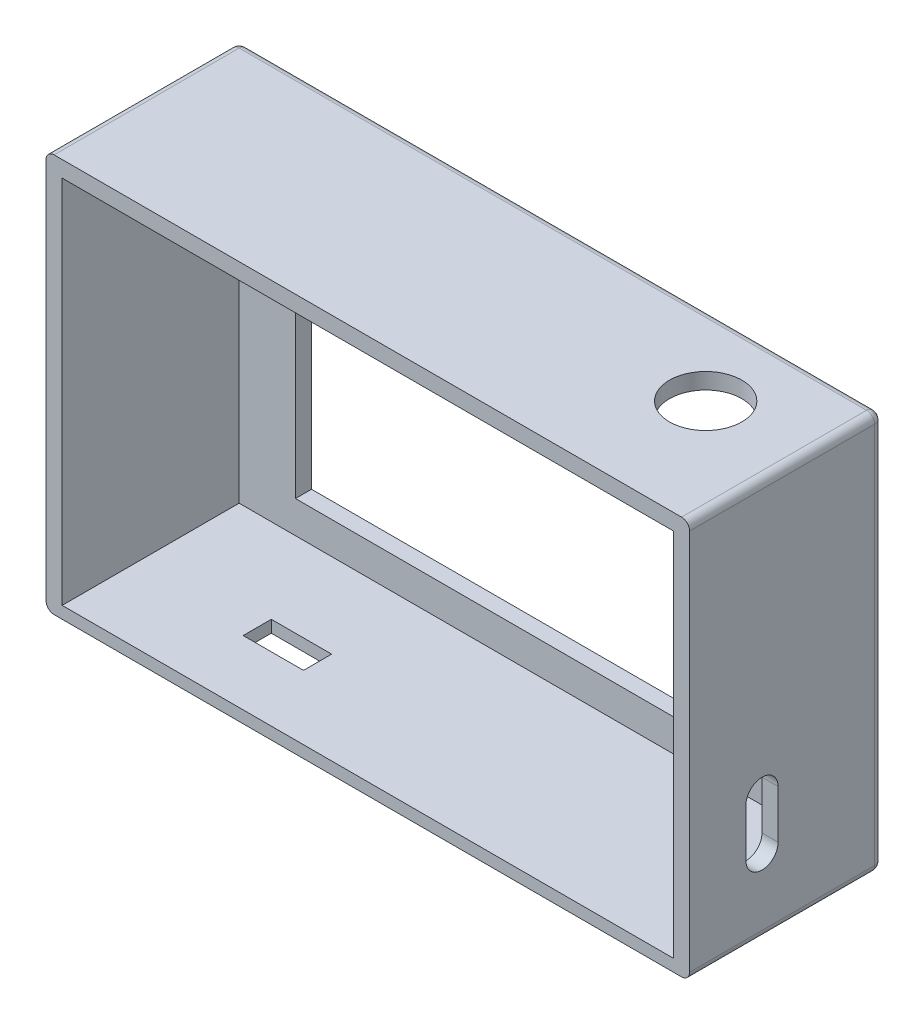
ISO-10303-21;
HEADER;
FILE_DESCRIPTION(('STEP AP214'),'2;1');
FILE_NAME('part.step','',(''),(''),'','','');
FILE_SCHEMA(('AUTOMOTIVE_DESIGN { 1 0 10303 214 1 1 1 1 }'));
ENDSEC;
DATA;
#1=APPLICATION_CONTEXT('core data for automotive mechanical design processes');
#2=APPLICATION_PROTOCOL_DEFINITION('international standard','automotive_design',2000,#1);
#3=PRODUCT_CONTEXT('',#1,'mechanical');
#4=PRODUCT('Part','Part','',(#3));
#5=PRODUCT_RELATED_PRODUCT_CATEGORY('part','',(#4));
#6=PRODUCT_DEFINITION_FORMATION('','',#4);
#7=PRODUCT_DEFINITION_CONTEXT('part definition',#1,'design');
#8=PRODUCT_DEFINITION('design','',#6,#7);
#9=PRODUCT_DEFINITION_SHAPE('','',#8);
#10=(LENGTH_UNIT() NAMED_UNIT(*) SI_UNIT(.MILLI.,.METRE.));
#11=(NAMED_UNIT(*) PLANE_ANGLE_UNIT() SI_UNIT($,.RADIAN.));
#12=(NAMED_UNIT(*) SI_UNIT($,.STERADIAN.) SOLID_ANGLE_UNIT());
#13=UNCERTAINTY_MEASURE_WITH_UNIT(LENGTH_MEASURE(1.E-05),#10,'distance_accuracy_value','');
#14=(GEOMETRIC_REPRESENTATION_CONTEXT(3) GLOBAL_UNCERTAINTY_ASSIGNED_CONTEXT((#13)) GLOBAL_UNIT_ASSIGNED_CONTEXT((#10,
#11,#12)) REPRESENTATION_CONTEXT('',''));
#15=CARTESIAN_POINT('',(0.,0.,0.));
#16=DIRECTION('',(0.,0.,1.));
#17=DIRECTION('',(1.,0.,0.));
#18=AXIS2_PLACEMENT_3D('',#15,#16,#17);
#19=CARTESIAN_POINT('',(38.,25.25,22.));
#20=DIRECTION('',(-1.,0.,0.));
#21=DIRECTION('',(0.,0.,1.));
#22=AXIS2_PLACEMENT_3D('',#19,#20,#21);
#23=PLANE('',#22);
#24=CARTESIAN_POINT('',(38.,-11.25,13.));
#25=DIRECTION('',(-1.,0.,0.));
#26=DIRECTION('',(0.,0.,1.));
#27=AXIS2_PLACEMENT_3D('',#24,#25,#26);
#28=CIRCLE('',#27,2.);
#29=CARTESIAN_POINT('',(38.,-11.25,11.));
#30=VERTEX_POINT('',#29);
#31=CARTESIAN_POINT('',(38.,-11.25,15.));
#32=VERTEX_POINT('',#31);
#33=EDGE_CURVE('E299',#30,#32,#28,.F.);
#34=ORIENTED_EDGE('',*,*,#33,.T.);
#35=DIRECTION('',(0.,-1.,0.));
#36=VECTOR('',#35,1.);
#37=CARTESIAN_POINT('',(38.,-11.25,15.));
#38=LINE('',#37,#36);
#39=CARTESIAN_POINT('',(38.,-17.25,15.));
#40=VERTEX_POINT('',#39);
#41=EDGE_CURVE('E301',#32,#40,#38,.T.);
#42=ORIENTED_EDGE('',*,*,#41,.T.);
#43=CARTESIAN_POINT('',(38.,-17.25,13.));
#44=DIRECTION('',(-1.,0.,0.));
#45=DIRECTION('',(0.,0.,1.));
#46=AXIS2_PLACEMENT_3D('',#43,#44,#45);
#47=CIRCLE('',#46,2.);
#48=CARTESIAN_POINT('',(38.,-17.25,11.));
#49=VERTEX_POINT('',#48);
#50=EDGE_CURVE('E325',#40,#49,#47,.F.);
#51=ORIENTED_EDGE('',*,*,#50,.T.);
#52=DIRECTION('',(0.,1.,0.));
#53=VECTOR('',#52,1.);
#54=CARTESIAN_POINT('',(38.,-11.25,11.));
#55=LINE('',#54,#53);
#56=EDGE_CURVE('E321',#49,#30,#55,.T.);
#57=ORIENTED_EDGE('',*,*,#56,.T.);
#58=EDGE_LOOP('',(#34,#42,#51,#57));
#59=FACE_BOUND('',#58,.T.);
#60=DIRECTION('',(0.,0.,-1.));
#61=VECTOR('',#60,1.);
#62=CARTESIAN_POINT('',(38.,-25.25,22.));
#63=LINE('',#62,#61);
#64=CARTESIAN_POINT('',(38.,-25.25,22.));
#65=VERTEX_POINT('',#64);
#66=CARTESIAN_POINT('',(38.,-25.25,0.));
#67=VERTEX_POINT('',#66);
#68=EDGE_CURVE('E339',#65,#67,#63,.T.);
#69=ORIENTED_EDGE('',*,*,#68,.F.);
#70=DIRECTION('',(0.,1.,0.));
#71=VECTOR('',#70,1.);
#72=CARTESIAN_POINT('',(38.,0.,22.));
#73=LINE('',#72,#71);
#74=CARTESIAN_POINT('',(38.,20.75,22.));
#75=VERTEX_POINT('',#74);
#76=EDGE_CURVE('E360',#65,#75,#73,.T.);
#77=ORIENTED_EDGE('',*,*,#76,.T.);
#78=DIRECTION('',(0.,0.,1.));
#79=VECTOR('',#78,1.);
#80=CARTESIAN_POINT('',(38.,20.75,0.));
#81=LINE('',#80,#79);
#82=CARTESIAN_POINT('',(38.,20.75,0.));
#83=VERTEX_POINT('',#82);
#84=EDGE_CURVE('E248',#83,#75,#81,.T.);
#85=ORIENTED_EDGE('',*,*,#84,.F.);
#86=DIRECTION('',(0.,1.,0.));
#87=VECTOR('',#86,1.);
#88=CARTESIAN_POINT('',(38.,25.25,0.));
#89=LINE('',#88,#87);
#90=EDGE_CURVE('E309',#67,#83,#89,.T.);
#91=ORIENTED_EDGE('',*,*,#90,.F.);
#92=EDGE_LOOP('',(#69,#77,#85,#91));
#93=FACE_BOUND('',#92,.T.);
#94=ADVANCED_FACE('F39',(#59,#93),#23,.T.);
#95=CARTESIAN_POINT('',(-38.,25.25,22.));
#96=DIRECTION('',(1.,0.,0.));
#97=DIRECTION('',(0.,0.,-1.));
#98=AXIS2_PLACEMENT_3D('',#95,#96,#97);
#99=PLANE('',#98);
#100=DIRECTION('',(0.,-1.,0.));
#101=VECTOR('',#100,1.);
#102=CARTESIAN_POINT('',(-38.,25.25,0.));
#103=LINE('',#102,#101);
#104=CARTESIAN_POINT('',(-38.,20.75,0.));
#105=VERTEX_POINT('',#104);
#106=CARTESIAN_POINT('',(-38.,-25.25,0.));
#107=VERTEX_POINT('',#106);
#108=EDGE_CURVE('E334',#105,#107,#103,.T.);
#109=ORIENTED_EDGE('',*,*,#108,.F.);
#110=DIRECTION('',(0.,0.,1.));
#111=VECTOR('',#110,1.);
#112=CARTESIAN_POINT('',(-38.,20.75,0.));
#113=LINE('',#112,#111);
#114=CARTESIAN_POINT('',(-38.,20.75,22.));
#115=VERTEX_POINT('',#114);
#116=EDGE_CURVE('E245',#105,#115,#113,.T.);
#117=ORIENTED_EDGE('',*,*,#116,.T.);
#118=DIRECTION('',(0.,-1.,0.));
#119=VECTOR('',#118,1.);
#120=CARTESIAN_POINT('',(-38.,0.,22.));
#121=LINE('',#120,#119);
#122=CARTESIAN_POINT('',(-38.,-25.25,22.));
#123=VERTEX_POINT('',#122);
#124=EDGE_CURVE('E354',#115,#123,#121,.T.);
#125=ORIENTED_EDGE('',*,*,#124,.T.);
#126=DIRECTION('',(0.,0.,-1.));
#127=VECTOR('',#126,1.);
#128=CARTESIAN_POINT('',(-38.,-25.25,22.));
#129=LINE('',#128,#127);
#130=EDGE_CURVE('E342',#123,#107,#129,.T.);
#131=ORIENTED_EDGE('',*,*,#130,.T.);
#132=EDGE_LOOP('',(#109,#117,#125,#131));
#133=FACE_BOUND('',#132,.T.);
#134=ADVANCED_FACE('F512',(#133),#99,.T.);
#135=CARTESIAN_POINT('',(0.,0.,0.));
#136=DIRECTION('',(0.,0.,-1.));
#137=DIRECTION('',(-1.,0.,0.));
#138=AXIS2_PLACEMENT_3D('',#135,#136,#137);
#139=PLANE('',#138);
#140=DIRECTION('',(1.,0.,0.));
#141=VECTOR('',#140,1.);
#142=CARTESIAN_POINT('',(0.,17.25,0.));
#143=LINE('',#142,#141);
#144=CARTESIAN_POINT('',(-31.,17.25,0.));
#145=VERTEX_POINT('',#144);
#146=CARTESIAN_POINT('',(31.,17.25,0.));
#147=VERTEX_POINT('',#146);
#148=EDGE_CURVE('E230',#145,#147,#143,.T.);
#149=ORIENTED_EDGE('',*,*,#148,.T.);
#150=DIRECTION('',(0.,-1.,0.));
#151=VECTOR('',#150,1.);
#152=CARTESIAN_POINT('',(31.,-19.25,0.));
#153=LINE('',#152,#151);
#154=CARTESIAN_POINT('',(31.,-21.25,0.));
#155=VERTEX_POINT('',#154);
#156=EDGE_CURVE('E277',#147,#155,#153,.T.);
#157=ORIENTED_EDGE('',*,*,#156,.T.);
#158=DIRECTION('',(-1.,0.,0.));
#159=VECTOR('',#158,1.);
#160=CARTESIAN_POINT('',(31.,-21.25,0.));
#161=LINE('',#160,#159);
#162=CARTESIAN_POINT('',(-31.,-21.25,0.));
#163=VERTEX_POINT('',#162);
#164=EDGE_CURVE('E253',#155,#163,#161,.T.);
#165=ORIENTED_EDGE('',*,*,#164,.T.);
#166=DIRECTION('',(0.,1.,0.));
#167=VECTOR('',#166,1.);
#168=CARTESIAN_POINT('',(-31.,16.75,0.));
#169=LINE('',#168,#167);
#170=EDGE_CURVE('E275',#163,#145,#169,.T.);
#171=ORIENTED_EDGE('',*,*,#170,.T.);
#172=EDGE_LOOP('',(#149,#157,#165,#171));
#173=FACE_BOUND('',#172,.T.);
#174=DIRECTION('',(-1.,0.,0.));
#175=VECTOR('',#174,1.);
#176=CARTESIAN_POINT('',(38.,20.75,0.));
#177=LINE('',#176,#175);
#178=EDGE_CURVE('E243',#83,#105,#177,.T.);
#179=ORIENTED_EDGE('',*,*,#178,.T.);
#180=ORIENTED_EDGE('',*,*,#108,.T.);
#181=DIRECTION('',(1.,0.,0.));
#182=VECTOR('',#181,1.);
#183=CARTESIAN_POINT('',(-38.,-25.25,0.));
#184=LINE('',#183,#182);
#185=EDGE_CURVE('E336',#107,#67,#184,.T.);
#186=ORIENTED_EDGE('',*,*,#185,.T.);
#187=ORIENTED_EDGE('',*,*,#90,.T.);
#188=EDGE_LOOP('',(#179,#180,#186,#187));
#189=FACE_BOUND('',#188,.T.);
#190=ADVANCED_FACE('F506',(#173,#189),#139,.F.);
#191=CARTESIAN_POINT('',(0.,0.,22.));
#192=DIRECTION('',(0.,0.,1.));
#193=DIRECTION('',(1.,0.,0.));
#194=AXIS2_PLACEMENT_3D('',#191,#192,#193);
#195=PLANE('',#194);
#196=ORIENTED_EDGE('',*,*,#76,.F.);
#197=DIRECTION('',(1.,0.,0.));
#198=VECTOR('',#197,1.);
#199=CARTESIAN_POINT('',(0.,-25.25,22.));
#200=LINE('',#199,#198);
#201=EDGE_CURVE('E351',#123,#65,#200,.T.);
#202=ORIENTED_EDGE('',*,*,#201,.F.);
#203=ORIENTED_EDGE('',*,*,#124,.F.);
#204=DIRECTION('',(-1.,0.,0.));
#205=VECTOR('',#204,1.);
#206=CARTESIAN_POINT('',(0.,20.75,22.));
#207=LINE('',#206,#205);
#208=EDGE_CURVE('E357',#75,#115,#207,.T.);
#209=ORIENTED_EDGE('',*,*,#208,.F.);
#210=EDGE_LOOP('',(#196,#202,#203,#209));
#211=FACE_BOUND('',#210,.T.);
#212=DIRECTION('',(-1.,0.,0.));
#213=VECTOR('',#212,1.);
#214=CARTESIAN_POINT('',(40.,-26.75,22.));
#215=LINE('',#214,#213);
#216=CARTESIAN_POINT('',(39.,-26.75,22.));
#217=VERTEX_POINT('',#216);
#218=CARTESIAN_POINT('',(-39.,-26.75,22.));
#219=VERTEX_POINT('',#218);
#220=EDGE_CURVE('E221',#217,#219,#215,.T.);
#221=ORIENTED_EDGE('',*,*,#220,.F.);
#222=CARTESIAN_POINT('',(39.,-25.75,22.));
#223=DIRECTION('',(0.,0.,1.));
#224=DIRECTION('',(1.,0.,0.));
#225=AXIS2_PLACEMENT_3D('',#222,#223,#224);
#226=CIRCLE('',#225,1.);
#227=CARTESIAN_POINT('',(40.,-25.75,22.));
#228=VERTEX_POINT('',#227);
#229=EDGE_CURVE('E376',#217,#228,#226,.T.);
#230=ORIENTED_EDGE('',*,*,#229,.T.);
#231=DIRECTION('',(0.,1.,0.));
#232=VECTOR('',#231,1.);
#233=CARTESIAN_POINT('',(40.,25.75,22.));
#234=LINE('',#233,#232);
#235=CARTESIAN_POINT('',(40.,21.75,22.));
#236=VERTEX_POINT('',#235);
#237=EDGE_CURVE('E345',#228,#236,#234,.T.);
#238=ORIENTED_EDGE('',*,*,#237,.T.);
#239=CARTESIAN_POINT('',(39.,21.75,22.));
#240=DIRECTION('',(0.,0.,1.));
#241=DIRECTION('',(1.,0.,0.));
#242=AXIS2_PLACEMENT_3D('',#239,#240,#241);
#243=CIRCLE('',#242,1.);
#244=CARTESIAN_POINT('',(39.,22.75,22.));
#245=VERTEX_POINT('',#244);
#246=EDGE_CURVE('E372',#236,#245,#243,.T.);
#247=ORIENTED_EDGE('',*,*,#246,.T.);
#248=DIRECTION('',(1.,0.,0.));
#249=VECTOR('',#248,1.);
#250=CARTESIAN_POINT('',(-40.,22.75,22.));
#251=LINE('',#250,#249);
#252=CARTESIAN_POINT('',(-39.,22.75,22.));
#253=VERTEX_POINT('',#252);
#254=EDGE_CURVE('E250',#253,#245,#251,.T.);
#255=ORIENTED_EDGE('',*,*,#254,.F.);
#256=CARTESIAN_POINT('',(-39.,21.75,22.));
#257=DIRECTION('',(0.,0.,1.));
#258=DIRECTION('',(1.,0.,0.));
#259=AXIS2_PLACEMENT_3D('',#256,#257,#258);
#260=CIRCLE('',#259,1.);
#261=CARTESIAN_POINT('',(-40.,21.75,22.));
#262=VERTEX_POINT('',#261);
#263=EDGE_CURVE('E370',#253,#262,#260,.T.);
#264=ORIENTED_EDGE('',*,*,#263,.T.);
#265=DIRECTION('',(0.,-1.,0.));
#266=VECTOR('',#265,1.);
#267=CARTESIAN_POINT('',(-40.,25.75,22.));
#268=LINE('',#267,#266);
#269=CARTESIAN_POINT('',(-40.,-25.75,22.));
#270=VERTEX_POINT('',#269);
#271=EDGE_CURVE('E348',#262,#270,#268,.T.);
#272=ORIENTED_EDGE('',*,*,#271,.T.);
#273=CARTESIAN_POINT('',(-39.,-25.75,22.));
#274=DIRECTION('',(0.,0.,1.));
#275=DIRECTION('',(1.,0.,0.));
#276=AXIS2_PLACEMENT_3D('',#273,#274,#275);
#277=CIRCLE('',#276,1.);
#278=EDGE_CURVE('E374',#270,#219,#277,.T.);
#279=ORIENTED_EDGE('',*,*,#278,.T.);
#280=EDGE_LOOP('',(#221,#230,#238,#247,#255,#264,#272,#279));
#281=FACE_BOUND('',#280,.T.);
#282=ADVANCED_FACE('F477',(#211,#281),#195,.T.);
#283=CARTESIAN_POINT('',(40.,25.75,22.));
#284=DIRECTION('',(-1.,0.,0.));
#285=DIRECTION('',(0.,0.,1.));
#286=AXIS2_PLACEMENT_3D('',#283,#284,#285);
#287=PLANE('',#286);
#288=DIRECTION('',(0.,-1.,0.));
#289=VECTOR('',#288,1.);
#290=CARTESIAN_POINT('',(40.,-11.25,15.));
#291=LINE('',#290,#289);
#292=CARTESIAN_POINT('',(40.,-11.25,15.));
#293=VERTEX_POINT('',#292);
#294=CARTESIAN_POINT('',(40.,-17.25,15.));
#295=VERTEX_POINT('',#294);
#296=EDGE_CURVE('E313',#293,#295,#291,.T.);
#297=ORIENTED_EDGE('',*,*,#296,.F.);
#298=CARTESIAN_POINT('',(40.,-11.25,13.));
#299=DIRECTION('',(1.,0.,0.));
#300=DIRECTION('',(0.,1.,0.));
#301=AXIS2_PLACEMENT_3D('',#298,#299,#300);
#302=CIRCLE('',#301,2.);
#303=CARTESIAN_POINT('',(40.,-11.25,11.));
#304=VERTEX_POINT('',#303);
#305=EDGE_CURVE('E316',#304,#293,#302,.T.);
#306=ORIENTED_EDGE('',*,*,#305,.F.);
#307=DIRECTION('',(0.,1.,0.));
#308=VECTOR('',#307,1.);
#309=CARTESIAN_POINT('',(40.,-11.25,11.));
#310=LINE('',#309,#308);
#311=CARTESIAN_POINT('',(40.,-17.25,11.));
#312=VERTEX_POINT('',#311);
#313=EDGE_CURVE('E306',#312,#304,#310,.T.);
#314=ORIENTED_EDGE('',*,*,#313,.F.);
#315=CARTESIAN_POINT('',(40.,-17.25,13.));
#316=DIRECTION('',(1.,0.,0.));
#317=DIRECTION('',(0.,1.,0.));
#318=AXIS2_PLACEMENT_3D('',#315,#316,#317);
#319=CIRCLE('',#318,2.);
#320=EDGE_CURVE('E310',#295,#312,#319,.T.);
#321=ORIENTED_EDGE('',*,*,#320,.F.);
#322=EDGE_LOOP('',(#297,#306,#314,#321));
#323=FACE_BOUND('',#322,.T.);
#324=ORIENTED_EDGE('',*,*,#237,.F.);
#325=DIRECTION('',(0.,0.,1.));
#326=VECTOR('',#325,1.);
#327=CARTESIAN_POINT('',(40.,-25.75,-2.));
#328=LINE('',#327,#326);
#329=CARTESIAN_POINT('',(40.,-25.75,-1.));
#330=VERTEX_POINT('',#329);
#331=EDGE_CURVE('E382',#228,#330,#328,.F.);
#332=ORIENTED_EDGE('',*,*,#331,.T.);
#333=DIRECTION('',(0.,-1.,0.));
#334=VECTOR('',#333,1.);
#335=CARTESIAN_POINT('',(40.,22.75,-1.));
#336=LINE('',#335,#334);
#337=CARTESIAN_POINT('',(40.,21.75,-1.));
#338=VERTEX_POINT('',#337);
#339=EDGE_CURVE('E380',#330,#338,#336,.F.);
#340=ORIENTED_EDGE('',*,*,#339,.T.);
#341=DIRECTION('',(0.,0.,-1.));
#342=VECTOR('',#341,1.);
#343=CARTESIAN_POINT('',(40.,21.75,22.));
#344=LINE('',#343,#342);
#345=EDGE_CURVE('E378',#338,#236,#344,.F.);
#346=ORIENTED_EDGE('',*,*,#345,.T.);
#347=EDGE_LOOP('',(#324,#332,#340,#346));
#348=FACE_BOUND('',#347,.T.);
#349=ADVANCED_FACE('F497',(#323,#348),#287,.F.);
#350=CARTESIAN_POINT('',(-40.,25.75,22.));
#351=DIRECTION('',(1.,0.,0.));
#352=DIRECTION('',(0.,0.,-1.));
#353=AXIS2_PLACEMENT_3D('',#350,#351,#352);
#354=PLANE('',#353);
#355=DIRECTION('',(0.,1.,0.));
#356=VECTOR('',#355,1.);
#357=CARTESIAN_POINT('',(-40.,-26.75,-1.));
#358=LINE('',#357,#356);
#359=CARTESIAN_POINT('',(-40.,21.75,-1.));
#360=VERTEX_POINT('',#359);
#361=CARTESIAN_POINT('',(-40.,-25.75,-1.));
#362=VERTEX_POINT('',#361);
#363=EDGE_CURVE('E386',#360,#362,#358,.F.);
#364=ORIENTED_EDGE('',*,*,#363,.T.);
#365=DIRECTION('',(0.,0.,-1.));
#366=VECTOR('',#365,1.);
#367=CARTESIAN_POINT('',(-40.,-25.75,22.));
#368=LINE('',#367,#366);
#369=EDGE_CURVE('E388',#362,#270,#368,.F.);
#370=ORIENTED_EDGE('',*,*,#369,.T.);
#371=ORIENTED_EDGE('',*,*,#271,.F.);
#372=DIRECTION('',(0.,0.,1.));
#373=VECTOR('',#372,1.);
#374=CARTESIAN_POINT('',(-40.,21.75,-2.));
#375=LINE('',#374,#373);
#376=EDGE_CURVE('E384',#262,#360,#375,.F.);
#377=ORIENTED_EDGE('',*,*,#376,.T.);
#378=EDGE_LOOP('',(#364,#370,#371,#377));
#379=FACE_BOUND('',#378,.T.);
#380=ADVANCED_FACE('F475',(#379),#354,.F.);
#381=CARTESIAN_POINT('',(0.,0.,-2.));
#382=DIRECTION('',(0.,0.,-1.));
#383=DIRECTION('',(-1.,0.,0.));
#384=AXIS2_PLACEMENT_3D('',#381,#382,#383);
#385=PLANE('',#384);
#386=DIRECTION('',(0.,-1.,0.));
#387=VECTOR('',#386,1.);
#388=CARTESIAN_POINT('',(31.,-19.25,-2.));
#389=LINE('',#388,#387);
#390=CARTESIAN_POINT('',(31.,17.25,-2.));
#391=VERTEX_POINT('',#390);
#392=CARTESIAN_POINT('',(31.,-21.25,-2.));
#393=VERTEX_POINT('',#392);
#394=EDGE_CURVE('E220',#391,#393,#389,.T.);
#395=ORIENTED_EDGE('',*,*,#394,.F.);
#396=DIRECTION('',(1.,0.,0.));
#397=VECTOR('',#396,1.);
#398=CARTESIAN_POINT('',(31.,17.25,-2.));
#399=LINE('',#398,#397);
#400=CARTESIAN_POINT('',(-31.,17.25,-2.));
#401=VERTEX_POINT('',#400);
#402=EDGE_CURVE('E228',#401,#391,#399,.T.);
#403=ORIENTED_EDGE('',*,*,#402,.F.);
#404=DIRECTION('',(0.,1.,0.));
#405=VECTOR('',#404,1.);
#406=CARTESIAN_POINT('',(-31.,16.75,-2.));
#407=LINE('',#406,#405);
#408=CARTESIAN_POINT('',(-31.,-21.25,-2.));
#409=VERTEX_POINT('',#408);
#410=EDGE_CURVE('E210',#409,#401,#407,.T.);
#411=ORIENTED_EDGE('',*,*,#410,.F.);
#412=DIRECTION('',(-1.,0.,0.));
#413=VECTOR('',#412,1.);
#414=CARTESIAN_POINT('',(31.,-21.25,-2.));
#415=LINE('',#414,#413);
#416=EDGE_CURVE('E252',#393,#409,#415,.T.);
#417=ORIENTED_EDGE('',*,*,#416,.F.);
#418=EDGE_LOOP('',(#395,#403,#411,#417));
#419=FACE_BOUND('',#418,.T.);
#420=DIRECTION('',(0.,-1.,0.));
#421=VECTOR('',#420,1.);
#422=CARTESIAN_POINT('',(39.,-26.75,-2.));
#423=LINE('',#422,#421);
#424=CARTESIAN_POINT('',(39.,21.75,-2.));
#425=VERTEX_POINT('',#424);
#426=CARTESIAN_POINT('',(39.,-25.75,-2.));
#427=VERTEX_POINT('',#426);
#428=EDGE_CURVE('E392',#425,#427,#423,.T.);
#429=ORIENTED_EDGE('',*,*,#428,.T.);
#430=DIRECTION('',(1.,0.,0.));
#431=VECTOR('',#430,1.);
#432=CARTESIAN_POINT('',(0.,-25.75,-2.));
#433=LINE('',#432,#431);
#434=CARTESIAN_POINT('',(-39.,-25.75,-2.));
#435=VERTEX_POINT('',#434);
#436=EDGE_CURVE('E397',#427,#435,#433,.F.);
#437=ORIENTED_EDGE('',*,*,#436,.T.);
#438=DIRECTION('',(0.,1.,0.));
#439=VECTOR('',#438,1.);
#440=CARTESIAN_POINT('',(-39.,22.75,-2.));
#441=LINE('',#440,#439);
#442=CARTESIAN_POINT('',(-39.,21.75,-2.));
#443=VERTEX_POINT('',#442);
#444=EDGE_CURVE('E394',#435,#443,#441,.T.);
#445=ORIENTED_EDGE('',*,*,#444,.T.);
#446=DIRECTION('',(-1.,0.,0.));
#447=VECTOR('',#446,1.);
#448=CARTESIAN_POINT('',(0.,21.75,-2.));
#449=LINE('',#448,#447);
#450=EDGE_CURVE('E390',#443,#425,#449,.F.);
#451=ORIENTED_EDGE('',*,*,#450,.T.);
#452=EDGE_LOOP('',(#429,#437,#445,#451));
#453=FACE_BOUND('',#452,.T.);
#454=ADVANCED_FACE('F233',(#419,#453),#385,.T.);
#455=CARTESIAN_POINT('',(-38.,-25.25,22.));
#456=DIRECTION('',(0.,1.,0.));
#457=DIRECTION('',(0.,0.,1.));
#458=AXIS2_PLACEMENT_3D('',#455,#456,#457);
#459=PLANE('',#458);
#460=DIRECTION('',(0.,0.,-1.));
#461=VECTOR('',#460,1.);
#462=CARTESIAN_POINT('',(-23.5,-25.25,14.));
#463=LINE('',#462,#461);
#464=CARTESIAN_POINT('',(-23.5,-25.25,14.));
#465=VERTEX_POINT('',#464);
#466=CARTESIAN_POINT('',(-23.5,-25.25,10.5));
#467=VERTEX_POINT('',#466);
#468=EDGE_CURVE('E278',#465,#467,#463,.T.);
#469=ORIENTED_EDGE('',*,*,#468,.T.);
#470=DIRECTION('',(1.,0.,0.));
#471=VECTOR('',#470,1.);
#472=CARTESIAN_POINT('',(-23.5,-25.25,10.5));
#473=LINE('',#472,#471);
#474=CARTESIAN_POINT('',(-16.,-25.25,10.5));
#475=VERTEX_POINT('',#474);
#476=EDGE_CURVE('E281',#467,#475,#473,.T.);
#477=ORIENTED_EDGE('',*,*,#476,.T.);
#478=DIRECTION('',(0.,0.,1.));
#479=VECTOR('',#478,1.);
#480=CARTESIAN_POINT('',(-16.,-25.25,14.));
#481=LINE('',#480,#479);
#482=CARTESIAN_POINT('',(-16.,-25.25,14.));
#483=VERTEX_POINT('',#482);
#484=EDGE_CURVE('E293',#475,#483,#481,.T.);
#485=ORIENTED_EDGE('',*,*,#484,.T.);
#486=DIRECTION('',(-1.,0.,0.));
#487=VECTOR('',#486,1.);
#488=CARTESIAN_POINT('',(-23.5,-25.25,14.));
#489=LINE('',#488,#487);
#490=EDGE_CURVE('E289',#483,#465,#489,.T.);
#491=ORIENTED_EDGE('',*,*,#490,.T.);
#492=EDGE_LOOP('',(#469,#477,#485,#491));
#493=FACE_BOUND('',#492,.T.);
#494=ORIENTED_EDGE('',*,*,#130,.F.);
#495=ORIENTED_EDGE('',*,*,#201,.T.);
#496=ORIENTED_EDGE('',*,*,#68,.T.);
#497=ORIENTED_EDGE('',*,*,#185,.F.);
#498=EDGE_LOOP('',(#494,#495,#496,#497));
#499=FACE_BOUND('',#498,.T.);
#500=ADVANCED_FACE('F522',(#493,#499),#459,.T.);
#501=CARTESIAN_POINT('',(-40.001,-11.25,13.));
#502=DIRECTION('',(1.,0.,0.));
#503=DIRECTION('',(0.,1.,0.));
#504=AXIS2_PLACEMENT_3D('',#501,#502,#503);
#505=CYLINDRICAL_SURFACE('',#504,2.);
#506=DIRECTION('',(1.,0.,0.));
#507=VECTOR('',#506,1.);
#508=CARTESIAN_POINT('',(-40.001,-11.25,11.));
#509=LINE('',#508,#507);
#510=EDGE_CURVE('E324',#30,#304,#509,.T.);
#511=ORIENTED_EDGE('',*,*,#510,.T.);
#512=ORIENTED_EDGE('',*,*,#305,.T.);
#513=DIRECTION('',(1.,0.,0.));
#514=VECTOR('',#513,1.);
#515=CARTESIAN_POINT('',(-40.001,-11.25,15.));
#516=LINE('',#515,#514);
#517=EDGE_CURVE('E320',#32,#293,#516,.T.);
#518=ORIENTED_EDGE('',*,*,#517,.F.);
#519=ORIENTED_EDGE('',*,*,#33,.F.);
#520=EDGE_LOOP('',(#511,#512,#518,#519));
#521=FACE_BOUND('',#520,.T.);
#522=ADVANCED_FACE('F525',(#521),#505,.F.);
#523=CARTESIAN_POINT('',(-40.001,-11.25,11.));
#524=DIRECTION('',(0.,0.,-1.));
#525=DIRECTION('',(-1.,0.,0.));
#526=AXIS2_PLACEMENT_3D('',#523,#524,#525);
#527=PLANE('',#526);
#528=DIRECTION('',(1.,0.,0.));
#529=VECTOR('',#528,1.);
#530=CARTESIAN_POINT('',(-40.001,-17.25,11.));
#531=LINE('',#530,#529);
#532=EDGE_CURVE('E305',#49,#312,#531,.T.);
#533=ORIENTED_EDGE('',*,*,#532,.T.);
#534=ORIENTED_EDGE('',*,*,#313,.T.);
#535=ORIENTED_EDGE('',*,*,#510,.F.);
#536=ORIENTED_EDGE('',*,*,#56,.F.);
#537=EDGE_LOOP('',(#533,#534,#535,#536));
#538=FACE_BOUND('',#537,.T.);
#539=ADVANCED_FACE('F529',(#538),#527,.F.);
#540=CARTESIAN_POINT('',(-40.001,-17.25,13.));
#541=DIRECTION('',(1.,0.,0.));
#542=DIRECTION('',(0.,1.,0.));
#543=AXIS2_PLACEMENT_3D('',#540,#541,#542);
#544=CYLINDRICAL_SURFACE('',#543,2.);
#545=DIRECTION('',(1.,0.,0.));
#546=VECTOR('',#545,1.);
#547=CARTESIAN_POINT('',(-40.001,-17.25,15.));
#548=LINE('',#547,#546);
#549=EDGE_CURVE('E304',#40,#295,#548,.T.);
#550=ORIENTED_EDGE('',*,*,#549,.T.);
#551=ORIENTED_EDGE('',*,*,#320,.T.);
#552=ORIENTED_EDGE('',*,*,#532,.F.);
#553=ORIENTED_EDGE('',*,*,#50,.F.);
#554=EDGE_LOOP('',(#550,#551,#552,#553));
#555=FACE_BOUND('',#554,.T.);
#556=ADVANCED_FACE('F533',(#555),#544,.F.);
#557=CARTESIAN_POINT('',(-40.001,-11.25,15.));
#558=DIRECTION('',(0.,0.,1.));
#559=DIRECTION('',(1.,0.,0.));
#560=AXIS2_PLACEMENT_3D('',#557,#558,#559);
#561=PLANE('',#560);
#562=ORIENTED_EDGE('',*,*,#517,.T.);
#563=ORIENTED_EDGE('',*,*,#296,.T.);
#564=ORIENTED_EDGE('',*,*,#549,.F.);
#565=ORIENTED_EDGE('',*,*,#41,.F.);
#566=EDGE_LOOP('',(#562,#563,#564,#565));
#567=FACE_BOUND('',#566,.T.);
#568=ADVANCED_FACE('F537',(#567),#561,.F.);
#569=CARTESIAN_POINT('',(-23.5,25.751,14.));
#570=DIRECTION('',(-1.,0.,0.));
#571=DIRECTION('',(0.,0.,1.));
#572=AXIS2_PLACEMENT_3D('',#569,#570,#571);
#573=PLANE('',#572);
#574=DIRECTION('',(0.,-1.,0.));
#575=VECTOR('',#574,1.);
#576=CARTESIAN_POINT('',(-23.5,25.751,14.));
#577=LINE('',#576,#575);
#578=CARTESIAN_POINT('',(-23.5,-26.75,14.));
#579=VERTEX_POINT('',#578);
#580=EDGE_CURVE('E292',#465,#579,#577,.T.);
#581=ORIENTED_EDGE('',*,*,#580,.T.);
#582=DIRECTION('',(0.,0.,1.));
#583=VECTOR('',#582,1.);
#584=CARTESIAN_POINT('',(-23.5,-26.75,10.5));
#585=LINE('',#584,#583);
#586=CARTESIAN_POINT('',(-23.5,-26.75,10.5));
#587=VERTEX_POINT('',#586);
#588=EDGE_CURVE('E267',#587,#579,#585,.T.);
#589=ORIENTED_EDGE('',*,*,#588,.F.);
#590=DIRECTION('',(0.,-1.,0.));
#591=VECTOR('',#590,1.);
#592=CARTESIAN_POINT('',(-23.5,25.751,10.5));
#593=LINE('',#592,#591);
#594=EDGE_CURVE('E288',#467,#587,#593,.T.);
#595=ORIENTED_EDGE('',*,*,#594,.F.);
#596=ORIENTED_EDGE('',*,*,#468,.F.);
#597=EDGE_LOOP('',(#581,#589,#595,#596));
#598=FACE_BOUND('',#597,.T.);
#599=ADVANCED_FACE('F541',(#598),#573,.F.);
#600=CARTESIAN_POINT('',(-23.5,25.751,14.));
#601=DIRECTION('',(0.,0.,1.));
#602=DIRECTION('',(1.,0.,0.));
#603=AXIS2_PLACEMENT_3D('',#600,#601,#602);
#604=PLANE('',#603);
#605=DIRECTION('',(0.,-1.,0.));
#606=VECTOR('',#605,1.);
#607=CARTESIAN_POINT('',(-16.,25.751,14.));
#608=LINE('',#607,#606);
#609=CARTESIAN_POINT('',(-16.,-26.75,14.));
#610=VERTEX_POINT('',#609);
#611=EDGE_CURVE('E285',#483,#610,#608,.T.);
#612=ORIENTED_EDGE('',*,*,#611,.T.);
#613=DIRECTION('',(1.,0.,0.));
#614=VECTOR('',#613,1.);
#615=CARTESIAN_POINT('',(-23.5,-26.75,14.));
#616=LINE('',#615,#614);
#617=EDGE_CURVE('E270',#579,#610,#616,.T.);
#618=ORIENTED_EDGE('',*,*,#617,.F.);
#619=ORIENTED_EDGE('',*,*,#580,.F.);
#620=ORIENTED_EDGE('',*,*,#490,.F.);
#621=EDGE_LOOP('',(#612,#618,#619,#620));
#622=FACE_BOUND('',#621,.T.);
#623=ADVANCED_FACE('F545',(#622),#604,.F.);
#624=CARTESIAN_POINT('',(-16.,25.751,14.));
#625=DIRECTION('',(1.,0.,0.));
#626=DIRECTION('',(0.,0.,-1.));
#627=AXIS2_PLACEMENT_3D('',#624,#625,#626);
#628=PLANE('',#627);
#629=DIRECTION('',(0.,-1.,0.));
#630=VECTOR('',#629,1.);
#631=CARTESIAN_POINT('',(-16.,25.751,10.5));
#632=LINE('',#631,#630);
#633=CARTESIAN_POINT('',(-16.,-26.75,10.5));
#634=VERTEX_POINT('',#633);
#635=EDGE_CURVE('E284',#475,#634,#632,.T.);
#636=ORIENTED_EDGE('',*,*,#635,.T.);
#637=DIRECTION('',(0.,0.,-1.));
#638=VECTOR('',#637,1.);
#639=CARTESIAN_POINT('',(-16.,-26.75,14.));
#640=LINE('',#639,#638);
#641=EDGE_CURVE('E259',#610,#634,#640,.T.);
#642=ORIENTED_EDGE('',*,*,#641,.F.);
#643=ORIENTED_EDGE('',*,*,#611,.F.);
#644=ORIENTED_EDGE('',*,*,#484,.F.);
#645=EDGE_LOOP('',(#636,#642,#643,#644));
#646=FACE_BOUND('',#645,.T.);
#647=ADVANCED_FACE('F549',(#646),#628,.F.);
#648=CARTESIAN_POINT('',(-23.5,25.751,10.5));
#649=DIRECTION('',(0.,0.,-1.));
#650=DIRECTION('',(-1.,0.,0.));
#651=AXIS2_PLACEMENT_3D('',#648,#649,#650);
#652=PLANE('',#651);
#653=ORIENTED_EDGE('',*,*,#594,.T.);
#654=DIRECTION('',(-1.,0.,0.));
#655=VECTOR('',#654,1.);
#656=CARTESIAN_POINT('',(-16.,-26.75,10.5));
#657=LINE('',#656,#655);
#658=EDGE_CURVE('E264',#634,#587,#657,.T.);
#659=ORIENTED_EDGE('',*,*,#658,.F.);
#660=ORIENTED_EDGE('',*,*,#635,.F.);
#661=ORIENTED_EDGE('',*,*,#476,.F.);
#662=EDGE_LOOP('',(#653,#659,#660,#661));
#663=FACE_BOUND('',#662,.T.);
#664=ADVANCED_FACE('F553',(#663),#652,.F.);
#665=CARTESIAN_POINT('',(-31.,16.75,0.));
#666=DIRECTION('',(-1.,0.,0.));
#667=DIRECTION('',(0.,0.,1.));
#668=AXIS2_PLACEMENT_3D('',#665,#666,#667);
#669=PLANE('',#668);
#670=ORIENTED_EDGE('',*,*,#410,.T.);
#671=DIRECTION('',(0.,0.,-1.));
#672=VECTOR('',#671,1.);
#673=CARTESIAN_POINT('',(-31.,17.25,8.));
#674=LINE('',#673,#672);
#675=EDGE_CURVE('E213',#145,#401,#674,.T.);
#676=ORIENTED_EDGE('',*,*,#675,.F.);
#677=ORIENTED_EDGE('',*,*,#170,.F.);
#678=DIRECTION('',(0.,0.,-1.));
#679=VECTOR('',#678,1.);
#680=CARTESIAN_POINT('',(-31.,-21.25,0.));
#681=LINE('',#680,#679);
#682=EDGE_CURVE('E215',#163,#409,#681,.T.);
#683=ORIENTED_EDGE('',*,*,#682,.T.);
#684=EDGE_LOOP('',(#670,#676,#677,#683));
#685=FACE_BOUND('',#684,.T.);
#686=ADVANCED_FACE('F212',(#685),#669,.F.);
#687=CARTESIAN_POINT('',(31.,-19.25,0.));
#688=DIRECTION('',(1.,0.,0.));
#689=DIRECTION('',(0.,0.,-1.));
#690=AXIS2_PLACEMENT_3D('',#687,#688,#689);
#691=PLANE('',#690);
#692=ORIENTED_EDGE('',*,*,#394,.T.);
#693=DIRECTION('',(0.,0.,-1.));
#694=VECTOR('',#693,1.);
#695=CARTESIAN_POINT('',(31.,-21.25,0.));
#696=LINE('',#695,#694);
#697=EDGE_CURVE('E256',#155,#393,#696,.T.);
#698=ORIENTED_EDGE('',*,*,#697,.F.);
#699=ORIENTED_EDGE('',*,*,#156,.F.);
#700=DIRECTION('',(0.,0.,-1.));
#701=VECTOR('',#700,1.);
#702=CARTESIAN_POINT('',(31.,17.25,8.));
#703=LINE('',#702,#701);
#704=EDGE_CURVE('E231',#147,#391,#703,.T.);
#705=ORIENTED_EDGE('',*,*,#704,.T.);
#706=EDGE_LOOP('',(#692,#698,#699,#705));
#707=FACE_BOUND('',#706,.T.);
#708=ADVANCED_FACE('F565',(#707),#691,.F.);
#709=CARTESIAN_POINT('',(0.,-26.75,0.));
#710=DIRECTION('',(0.,-1.,0.));
#711=DIRECTION('',(0.,0.,-1.));
#712=AXIS2_PLACEMENT_3D('',#709,#710,#711);
#713=PLANE('',#712);
#714=ORIENTED_EDGE('',*,*,#641,.T.);
#715=ORIENTED_EDGE('',*,*,#658,.T.);
#716=ORIENTED_EDGE('',*,*,#588,.T.);
#717=ORIENTED_EDGE('',*,*,#617,.T.);
#718=EDGE_LOOP('',(#714,#715,#716,#717));
#719=FACE_BOUND('',#718,.T.);
#720=DIRECTION('',(1.,0.,0.));
#721=VECTOR('',#720,1.);
#722=CARTESIAN_POINT('',(0.,-26.75,-1.));
#723=LINE('',#722,#721);
#724=CARTESIAN_POINT('',(-39.,-26.75,-1.));
#725=VERTEX_POINT('',#724);
#726=CARTESIAN_POINT('',(39.,-26.75,-1.));
#727=VERTEX_POINT('',#726);
#728=EDGE_CURVE('E363',#725,#727,#723,.T.);
#729=ORIENTED_EDGE('',*,*,#728,.T.);
#730=DIRECTION('',(0.,0.,1.));
#731=VECTOR('',#730,1.);
#732=CARTESIAN_POINT('',(39.,-26.75,22.));
#733=LINE('',#732,#731);
#734=EDGE_CURVE('E367',#727,#217,#733,.T.);
#735=ORIENTED_EDGE('',*,*,#734,.T.);
#736=ORIENTED_EDGE('',*,*,#220,.T.);
#737=DIRECTION('',(0.,0.,-1.));
#738=VECTOR('',#737,1.);
#739=CARTESIAN_POINT('',(-39.,-26.75,-2.));
#740=LINE('',#739,#738);
#741=EDGE_CURVE('E365',#219,#725,#740,.T.);
#742=ORIENTED_EDGE('',*,*,#741,.T.);
#743=EDGE_LOOP('',(#729,#735,#736,#742));
#744=FACE_BOUND('',#743,.T.);
#745=ADVANCED_FACE('F465',(#719,#744),#713,.T.);
#746=CARTESIAN_POINT('',(31.,-21.25,0.));
#747=DIRECTION('',(0.,-1.,0.));
#748=DIRECTION('',(0.,0.,-1.));
#749=AXIS2_PLACEMENT_3D('',#746,#747,#748);
#750=PLANE('',#749);
#751=ORIENTED_EDGE('',*,*,#416,.T.);
#752=ORIENTED_EDGE('',*,*,#682,.F.);
#753=ORIENTED_EDGE('',*,*,#164,.F.);
#754=ORIENTED_EDGE('',*,*,#697,.T.);
#755=EDGE_LOOP('',(#751,#752,#753,#754));
#756=FACE_BOUND('',#755,.T.);
#757=ADVANCED_FACE('F571',(#756),#750,.F.);
#758=CARTESIAN_POINT('',(0.,22.75,0.));
#759=DIRECTION('',(0.,1.,0.));
#760=DIRECTION('',(0.,0.,1.));
#761=AXIS2_PLACEMENT_3D('',#758,#759,#760);
#762=PLANE('',#761);
#763=CARTESIAN_POINT('',(28.,22.75,8.));
#764=DIRECTION('',(0.,1.,0.));
#765=DIRECTION('',(0.,0.,1.));
#766=AXIS2_PLACEMENT_3D('',#763,#764,#765);
#767=CIRCLE('',#766,4.5);
#768=CARTESIAN_POINT('',(28.,22.75,12.5));
#769=VERTEX_POINT('',#768);
#770=EDGE_CURVE('E240',#769,#769,#767,.T.);
#771=ORIENTED_EDGE('',*,*,#770,.F.);
#772=EDGE_LOOP('',(#771));
#773=FACE_BOUND('',#772,.T.);
#774=ORIENTED_EDGE('',*,*,#254,.T.);
#775=DIRECTION('',(0.,0.,-1.));
#776=VECTOR('',#775,1.);
#777=CARTESIAN_POINT('',(39.,22.75,-2.));
#778=LINE('',#777,#776);
#779=CARTESIAN_POINT('',(39.,22.75,-1.));
#780=VERTEX_POINT('',#779);
#781=EDGE_CURVE('E11',#245,#780,#778,.T.);
#782=ORIENTED_EDGE('',*,*,#781,.T.);
#783=DIRECTION('',(-1.,0.,0.));
#784=VECTOR('',#783,1.);
#785=CARTESIAN_POINT('',(0.,22.75,-1.));
#786=LINE('',#785,#784);
#787=CARTESIAN_POINT('',(-39.,22.75,-1.));
#788=VERTEX_POINT('',#787);
#789=EDGE_CURVE('E48',#780,#788,#786,.T.);
#790=ORIENTED_EDGE('',*,*,#789,.T.);
#791=DIRECTION('',(0.,0.,1.));
#792=VECTOR('',#791,1.);
#793=CARTESIAN_POINT('',(-39.,22.75,22.));
#794=LINE('',#793,#792);
#795=EDGE_CURVE('E399',#788,#253,#794,.T.);
#796=ORIENTED_EDGE('',*,*,#795,.T.);
#797=EDGE_LOOP('',(#774,#782,#790,#796));
#798=FACE_BOUND('',#797,.T.);
#799=ADVANCED_FACE('F480',(#773,#798),#762,.T.);
#800=CARTESIAN_POINT('',(38.,20.75,0.));
#801=DIRECTION('',(0.,1.,0.));
#802=DIRECTION('',(0.,0.,1.));
#803=AXIS2_PLACEMENT_3D('',#800,#801,#802);
#804=PLANE('',#803);
#805=CARTESIAN_POINT('',(28.,20.75,8.));
#806=DIRECTION('',(0.,1.,0.));
#807=DIRECTION('',(0.,0.,1.));
#808=AXIS2_PLACEMENT_3D('',#805,#806,#807);
#809=CIRCLE('',#808,4.5);
#810=CARTESIAN_POINT('',(28.,20.75,12.5));
#811=VERTEX_POINT('',#810);
#812=EDGE_CURVE('E43',#811,#811,#809,.T.);
#813=ORIENTED_EDGE('',*,*,#812,.T.);
#814=EDGE_LOOP('',(#813));
#815=FACE_BOUND('',#814,.T.);
#816=ORIENTED_EDGE('',*,*,#84,.T.);
#817=ORIENTED_EDGE('',*,*,#208,.T.);
#818=ORIENTED_EDGE('',*,*,#116,.F.);
#819=ORIENTED_EDGE('',*,*,#178,.F.);
#820=EDGE_LOOP('',(#816,#817,#818,#819));
#821=FACE_BOUND('',#820,.T.);
#822=ADVANCED_FACE('F578',(#815,#821),#804,.F.);
#823=CARTESIAN_POINT('',(-39.,21.75,0.));
#824=DIRECTION('',(0.,0.,-1.));
#825=DIRECTION('',(-1.,0.,0.));
#826=AXIS2_PLACEMENT_3D('',#823,#824,#825);
#827=CYLINDRICAL_SURFACE('',#826,1.);
#828=CARTESIAN_POINT('',(-39.,21.75,-1.));
#829=DIRECTION('',(0.,0.,-1.));
#830=DIRECTION('',(-1.,0.,0.));
#831=AXIS2_PLACEMENT_3D('',#828,#829,#830);
#832=CIRCLE('',#831,1.);
#833=EDGE_CURVE('E246',#360,#788,#832,.T.);
#834=ORIENTED_EDGE('',*,*,#833,.F.);
#835=ORIENTED_EDGE('',*,*,#376,.F.);
#836=ORIENTED_EDGE('',*,*,#263,.F.);
#837=ORIENTED_EDGE('',*,*,#795,.F.);
#838=EDGE_LOOP('',(#834,#835,#836,#837));
#839=FACE_BOUND('',#838,.T.);
#840=ADVANCED_FACE('F41',(#839),#827,.T.);
#841=CARTESIAN_POINT('',(-39.,21.75,-1.));
#842=DIRECTION('',(0.,1.,0.));
#843=DIRECTION('',(0.,0.,1.));
#844=AXIS2_PLACEMENT_3D('',#841,#842,#843);
#845=SPHERICAL_SURFACE('',#844,1.);
#846=CARTESIAN_POINT('',(-39.,21.75,-1.));
#847=DIRECTION('',(0.,1.,0.));
#848=DIRECTION('',(0.,0.,1.));
#849=AXIS2_PLACEMENT_3D('',#846,#847,#848);
#850=CIRCLE('',#849,1.);
#851=EDGE_CURVE('E429',#360,#443,#850,.F.);
#852=ORIENTED_EDGE('',*,*,#851,.F.);
#853=ORIENTED_EDGE('',*,*,#833,.T.);
#854=CARTESIAN_POINT('',(-39.,21.75,-1.));
#855=DIRECTION('',(-1.,0.,0.));
#856=DIRECTION('',(0.,0.,1.));
#857=AXIS2_PLACEMENT_3D('',#854,#855,#856);
#858=CIRCLE('',#857,1.);
#859=EDGE_CURVE('E432',#443,#788,#858,.F.);
#860=ORIENTED_EDGE('',*,*,#859,.F.);
#861=EDGE_LOOP('',(#852,#853,#860));
#862=FACE_BOUND('',#861,.T.);
#863=ADVANCED_FACE('F439',(#862),#845,.T.);
#864=CARTESIAN_POINT('',(39.,21.75,0.));
#865=DIRECTION('',(0.,0.,1.));
#866=DIRECTION('',(1.,0.,0.));
#867=AXIS2_PLACEMENT_3D('',#864,#865,#866);
#868=CYLINDRICAL_SURFACE('',#867,1.);
#869=ORIENTED_EDGE('',*,*,#246,.F.);
#870=ORIENTED_EDGE('',*,*,#345,.F.);
#871=CARTESIAN_POINT('',(39.,21.75,-1.));
#872=DIRECTION('',(0.,0.,-1.));
#873=DIRECTION('',(-1.,0.,0.));
#874=AXIS2_PLACEMENT_3D('',#871,#872,#873);
#875=CIRCLE('',#874,1.);
#876=EDGE_CURVE('E426',#780,#338,#875,.T.);
#877=ORIENTED_EDGE('',*,*,#876,.F.);
#878=ORIENTED_EDGE('',*,*,#781,.F.);
#879=EDGE_LOOP('',(#869,#870,#877,#878));
#880=FACE_BOUND('',#879,.T.);
#881=ADVANCED_FACE('F483',(#880),#868,.T.);
#882=CARTESIAN_POINT('',(0.,21.75,-1.));
#883=DIRECTION('',(-1.,0.,0.));
#884=DIRECTION('',(0.,0.,1.));
#885=AXIS2_PLACEMENT_3D('',#882,#883,#884);
#886=CYLINDRICAL_SURFACE('',#885,1.);
#887=ORIENTED_EDGE('',*,*,#859,.T.);
#888=ORIENTED_EDGE('',*,*,#789,.F.);
#889=CARTESIAN_POINT('',(39.,21.75,-1.));
#890=DIRECTION('',(1.,0.,0.));
#891=DIRECTION('',(0.,0.,-1.));
#892=AXIS2_PLACEMENT_3D('',#889,#890,#891);
#893=CIRCLE('',#892,1.);
#894=EDGE_CURVE('E423',#425,#780,#893,.T.);
#895=ORIENTED_EDGE('',*,*,#894,.F.);
#896=ORIENTED_EDGE('',*,*,#450,.F.);
#897=EDGE_LOOP('',(#887,#888,#895,#896));
#898=FACE_BOUND('',#897,.T.);
#899=ADVANCED_FACE('F444',(#898),#886,.T.);
#900=CARTESIAN_POINT('',(-39.,0.,-1.));
#901=DIRECTION('',(0.,-1.,0.));
#902=DIRECTION('',(0.,0.,-1.));
#903=AXIS2_PLACEMENT_3D('',#900,#901,#902);
#904=CYLINDRICAL_SURFACE('',#903,1.);
#905=ORIENTED_EDGE('',*,*,#851,.T.);
#906=ORIENTED_EDGE('',*,*,#444,.F.);
#907=CARTESIAN_POINT('',(-39.,-25.75,-1.));
#908=DIRECTION('',(0.,-1.,0.));
#909=DIRECTION('',(0.,0.,-1.));
#910=AXIS2_PLACEMENT_3D('',#907,#908,#909);
#911=CIRCLE('',#910,1.);
#912=EDGE_CURVE('E420',#362,#435,#911,.T.);
#913=ORIENTED_EDGE('',*,*,#912,.F.);
#914=ORIENTED_EDGE('',*,*,#363,.F.);
#915=EDGE_LOOP('',(#905,#906,#913,#914));
#916=FACE_BOUND('',#915,.T.);
#917=ADVANCED_FACE('F453',(#916),#904,.T.);
#918=CARTESIAN_POINT('',(-39.,-25.75,0.));
#919=DIRECTION('',(0.,0.,1.));
#920=DIRECTION('',(1.,0.,0.));
#921=AXIS2_PLACEMENT_3D('',#918,#919,#920);
#922=CYLINDRICAL_SURFACE('',#921,1.);
#923=ORIENTED_EDGE('',*,*,#278,.F.);
#924=ORIENTED_EDGE('',*,*,#369,.F.);
#925=CARTESIAN_POINT('',(-39.,-25.75,-1.));
#926=DIRECTION('',(0.,0.,-1.));
#927=DIRECTION('',(-1.,0.,0.));
#928=AXIS2_PLACEMENT_3D('',#925,#926,#927);
#929=CIRCLE('',#928,1.);
#930=EDGE_CURVE('E417',#725,#362,#929,.T.);
#931=ORIENTED_EDGE('',*,*,#930,.F.);
#932=ORIENTED_EDGE('',*,*,#741,.F.);
#933=EDGE_LOOP('',(#923,#924,#931,#932));
#934=FACE_BOUND('',#933,.T.);
#935=ADVANCED_FACE('F472',(#934),#922,.T.);
#936=CARTESIAN_POINT('',(39.,21.75,-1.));
#937=DIRECTION('',(0.,1.,0.));
#938=DIRECTION('',(0.,0.,1.));
#939=AXIS2_PLACEMENT_3D('',#936,#937,#938);
#940=SPHERICAL_SURFACE('',#939,1.);
#941=ORIENTED_EDGE('',*,*,#894,.T.);
#942=ORIENTED_EDGE('',*,*,#876,.T.);
#943=CARTESIAN_POINT('',(39.,21.75,-1.));
#944=DIRECTION('',(0.,1.,0.));
#945=DIRECTION('',(0.,0.,1.));
#946=AXIS2_PLACEMENT_3D('',#943,#944,#945);
#947=CIRCLE('',#946,1.);
#948=EDGE_CURVE('E414',#425,#338,#947,.F.);
#949=ORIENTED_EDGE('',*,*,#948,.F.);
#950=EDGE_LOOP('',(#941,#942,#949));
#951=FACE_BOUND('',#950,.T.);
#952=ADVANCED_FACE('F486',(#951),#940,.T.);
#953=CARTESIAN_POINT('',(-39.,-25.75,-1.));
#954=DIRECTION('',(-1.,0.,0.));
#955=DIRECTION('',(0.,0.,1.));
#956=AXIS2_PLACEMENT_3D('',#953,#954,#955);
#957=SPHERICAL_SURFACE('',#956,1.);
#958=ORIENTED_EDGE('',*,*,#930,.T.);
#959=ORIENTED_EDGE('',*,*,#912,.T.);
#960=CARTESIAN_POINT('',(-39.,-25.75,-1.));
#961=DIRECTION('',(-1.,0.,0.));
#962=DIRECTION('',(0.,0.,1.));
#963=AXIS2_PLACEMENT_3D('',#960,#961,#962);
#964=CIRCLE('',#963,1.);
#965=EDGE_CURVE('E411',#725,#435,#964,.F.);
#966=ORIENTED_EDGE('',*,*,#965,.F.);
#967=EDGE_LOOP('',(#958,#959,#966));
#968=FACE_BOUND('',#967,.T.);
#969=ADVANCED_FACE('F456',(#968),#957,.T.);
#970=CARTESIAN_POINT('',(39.,0.,-1.));
#971=DIRECTION('',(0.,1.,0.));
#972=DIRECTION('',(0.,0.,1.));
#973=AXIS2_PLACEMENT_3D('',#970,#971,#972);
#974=CYLINDRICAL_SURFACE('',#973,1.);
#975=ORIENTED_EDGE('',*,*,#948,.T.);
#976=ORIENTED_EDGE('',*,*,#339,.F.);
#977=CARTESIAN_POINT('',(39.,-25.75,-1.));
#978=DIRECTION('',(0.,-1.,0.));
#979=DIRECTION('',(0.,0.,-1.));
#980=AXIS2_PLACEMENT_3D('',#977,#978,#979);
#981=CIRCLE('',#980,1.);
#982=EDGE_CURVE('E408',#427,#330,#981,.T.);
#983=ORIENTED_EDGE('',*,*,#982,.F.);
#984=ORIENTED_EDGE('',*,*,#428,.F.);
#985=EDGE_LOOP('',(#975,#976,#983,#984));
#986=FACE_BOUND('',#985,.T.);
#987=ADVANCED_FACE('F489',(#986),#974,.T.);
#988=CARTESIAN_POINT('',(0.,-25.75,-1.));
#989=DIRECTION('',(1.,0.,0.));
#990=DIRECTION('',(0.,0.,-1.));
#991=AXIS2_PLACEMENT_3D('',#988,#989,#990);
#992=CYLINDRICAL_SURFACE('',#991,1.);
#993=ORIENTED_EDGE('',*,*,#965,.T.);
#994=ORIENTED_EDGE('',*,*,#436,.F.);
#995=CARTESIAN_POINT('',(39.,-25.75,-1.));
#996=DIRECTION('',(1.,0.,0.));
#997=DIRECTION('',(0.,0.,-1.));
#998=AXIS2_PLACEMENT_3D('',#995,#996,#997);
#999=CIRCLE('',#998,1.);
#1000=EDGE_CURVE('E405',#727,#427,#999,.T.);
#1001=ORIENTED_EDGE('',*,*,#1000,.F.);
#1002=ORIENTED_EDGE('',*,*,#728,.F.);
#1003=EDGE_LOOP('',(#993,#994,#1001,#1002));
#1004=FACE_BOUND('',#1003,.T.);
#1005=ADVANCED_FACE('F460',(#1004),#992,.T.);
#1006=CARTESIAN_POINT('',(39.,-25.75,-1.));
#1007=DIRECTION('',(0.,0.,-1.));
#1008=DIRECTION('',(-1.,0.,0.));
#1009=AXIS2_PLACEMENT_3D('',#1006,#1007,#1008);
#1010=SPHERICAL_SURFACE('',#1009,1.);
#1011=ORIENTED_EDGE('',*,*,#1000,.T.);
#1012=ORIENTED_EDGE('',*,*,#982,.T.);
#1013=CARTESIAN_POINT('',(39.,-25.75,-1.));
#1014=DIRECTION('',(0.,0.,-1.));
#1015=DIRECTION('',(-1.,0.,0.));
#1016=AXIS2_PLACEMENT_3D('',#1013,#1014,#1015);
#1017=CIRCLE('',#1016,1.);
#1018=EDGE_CURVE('E402',#727,#330,#1017,.F.);
#1019=ORIENTED_EDGE('',*,*,#1018,.F.);
#1020=EDGE_LOOP('',(#1011,#1012,#1019));
#1021=FACE_BOUND('',#1020,.T.);
#1022=ADVANCED_FACE('F491',(#1021),#1010,.T.);
#1023=CARTESIAN_POINT('',(39.,-25.75,0.));
#1024=DIRECTION('',(0.,0.,-1.));
#1025=DIRECTION('',(-1.,0.,0.));
#1026=AXIS2_PLACEMENT_3D('',#1023,#1024,#1025);
#1027=CYLINDRICAL_SURFACE('',#1026,1.);
#1028=ORIENTED_EDGE('',*,*,#1018,.T.);
#1029=ORIENTED_EDGE('',*,*,#331,.F.);
#1030=ORIENTED_EDGE('',*,*,#229,.F.);
#1031=ORIENTED_EDGE('',*,*,#734,.F.);
#1032=EDGE_LOOP('',(#1028,#1029,#1030,#1031));
#1033=FACE_BOUND('',#1032,.T.);
#1034=ADVANCED_FACE('F494',(#1033),#1027,.T.);
#1035=CARTESIAN_POINT('',(28.,12.75,8.));
#1036=DIRECTION('',(0.,1.,0.));
#1037=DIRECTION('',(0.,0.,1.));
#1038=AXIS2_PLACEMENT_3D('',#1035,#1036,#1037);
#1039=CYLINDRICAL_SURFACE('',#1038,4.5);
#1040=ORIENTED_EDGE('',*,*,#770,.T.);
#1041=EDGE_LOOP('',(#1040));
#1042=FACE_BOUND('',#1041,.T.);
#1043=ORIENTED_EDGE('',*,*,#812,.F.);
#1044=EDGE_LOOP('',(#1043));
#1045=FACE_BOUND('',#1044,.T.);
#1046=ADVANCED_FACE('F583',(#1042,#1045),#1039,.F.);
#1047=CARTESIAN_POINT('',(31.,17.25,8.));
#1048=DIRECTION('',(0.,1.,0.));
#1049=DIRECTION('',(0.,0.,1.));
#1050=AXIS2_PLACEMENT_3D('',#1047,#1048,#1049);
#1051=PLANE('',#1050);
#1052=ORIENTED_EDGE('',*,*,#675,.T.);
#1053=ORIENTED_EDGE('',*,*,#402,.T.);
#1054=ORIENTED_EDGE('',*,*,#704,.F.);
#1055=ORIENTED_EDGE('',*,*,#148,.F.);
#1056=EDGE_LOOP('',(#1052,#1053,#1054,#1055));
#1057=FACE_BOUND('',#1056,.T.);
#1058=ADVANCED_FACE('F226',(#1057),#1051,.F.);
#1059=CLOSED_SHELL('',(#94,#134,#190,#282,#349,#380,#454,#500,#522,#539,#556,#568,#599,#623,
#647,#664,#686,#708,#745,#757,#799,#822,#840,#863,#881,#899,#917,#935,#952,#969,#987,#1005,
#1022,#1034,#1046,#1058));
#1060=MANIFOLD_SOLID_BREP('B2',#1059);
#1061=ADVANCED_BREP_SHAPE_REPRESENTATION('',(#18,#1060),#14);
#1062=SHAPE_DEFINITION_REPRESENTATION(#9,#1061);
ENDSEC;
END-ISO-10303-21;
